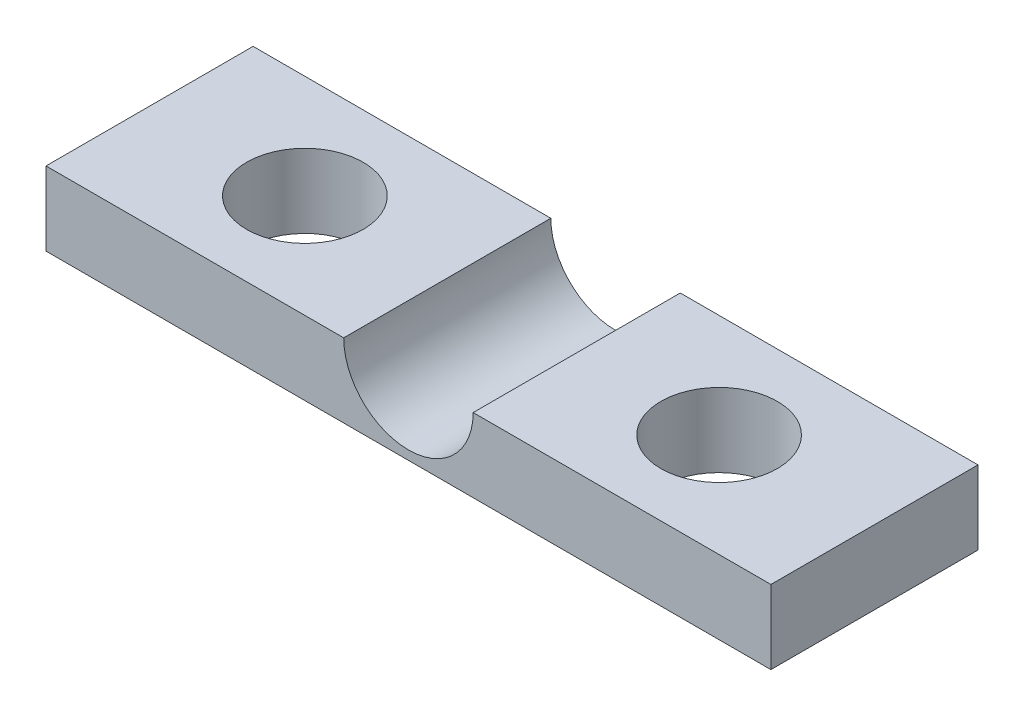
ISO-10303-21;
HEADER;
FILE_DESCRIPTION(('STEP AP214'),'2;1');
FILE_NAME('part.step','',(''),(''),'','','');
FILE_SCHEMA(('AUTOMOTIVE_DESIGN { 1 0 10303 214 1 1 1 1 }'));
ENDSEC;
DATA;
#1=APPLICATION_CONTEXT('core data for automotive mechanical design processes');
#2=APPLICATION_PROTOCOL_DEFINITION('international standard','automotive_design',2000,#1);
#3=PRODUCT_CONTEXT('',#1,'mechanical');
#4=PRODUCT('Part','Part','',(#3));
#5=PRODUCT_RELATED_PRODUCT_CATEGORY('part','',(#4));
#6=PRODUCT_DEFINITION_FORMATION('','',#4);
#7=PRODUCT_DEFINITION_CONTEXT('part definition',#1,'design');
#8=PRODUCT_DEFINITION('design','',#6,#7);
#9=PRODUCT_DEFINITION_SHAPE('','',#8);
#10=(LENGTH_UNIT() NAMED_UNIT(*) SI_UNIT(.MILLI.,.METRE.));
#11=(NAMED_UNIT(*) PLANE_ANGLE_UNIT() SI_UNIT($,.RADIAN.));
#12=(NAMED_UNIT(*) SI_UNIT($,.STERADIAN.) SOLID_ANGLE_UNIT());
#13=UNCERTAINTY_MEASURE_WITH_UNIT(LENGTH_MEASURE(1.E-05),#10,'distance_accuracy_value','');
#14=(GEOMETRIC_REPRESENTATION_CONTEXT(3) GLOBAL_UNCERTAINTY_ASSIGNED_CONTEXT((#13)) GLOBAL_UNIT_ASSIGNED_CONTEXT((#10,
#11,#12)) REPRESENTATION_CONTEXT('',''));
#15=CARTESIAN_POINT('',(0.,0.,0.));
#16=DIRECTION('',(0.,0.,1.));
#17=DIRECTION('',(1.,0.,0.));
#18=AXIS2_PLACEMENT_3D('',#15,#16,#17);
#19=CARTESIAN_POINT('',(0.,2.85,8.));
#20=DIRECTION('',(-1.,0.,0.));
#21=DIRECTION('',(0.,-1.,0.));
#22=AXIS2_PLACEMENT_3D('',#19,#20,#21);
#23=PLANE('',#22);
#24=DIRECTION('',(0.,1.,0.));
#25=VECTOR('',#24,1.);
#26=CARTESIAN_POINT('',(0.,2.85,0.));
#27=LINE('',#26,#25);
#28=CARTESIAN_POINT('',(0.,0.,0.));
#29=VERTEX_POINT('',#28);
#30=CARTESIAN_POINT('',(0.,2.85,0.));
#31=VERTEX_POINT('',#30);
#32=EDGE_CURVE('E125',#29,#31,#27,.T.);
#33=ORIENTED_EDGE('',*,*,#32,.T.);
#34=DIRECTION('',(0.,0.,-1.));
#35=VECTOR('',#34,1.);
#36=CARTESIAN_POINT('',(0.,2.85,8.));
#37=LINE('',#36,#35);
#38=CARTESIAN_POINT('',(0.,2.85,8.));
#39=VERTEX_POINT('',#38);
#40=EDGE_CURVE('E11',#39,#31,#37,.T.);
#41=ORIENTED_EDGE('',*,*,#40,.F.);
#42=DIRECTION('',(0.,1.,0.));
#43=VECTOR('',#42,1.);
#44=CARTESIAN_POINT('',(0.,2.85,8.));
#45=LINE('',#44,#43);
#46=CARTESIAN_POINT('',(0.,0.,8.));
#47=VERTEX_POINT('',#46);
#48=EDGE_CURVE('E136',#47,#39,#45,.T.);
#49=ORIENTED_EDGE('',*,*,#48,.F.);
#50=DIRECTION('',(0.,0.,-1.));
#51=VECTOR('',#50,1.);
#52=CARTESIAN_POINT('',(0.,0.,8.));
#53=LINE('',#52,#51);
#54=EDGE_CURVE('E121',#47,#29,#53,.T.);
#55=ORIENTED_EDGE('',*,*,#54,.T.);
#56=EDGE_LOOP('',(#33,#41,#49,#55));
#57=FACE_BOUND('',#56,.T.);
#58=ADVANCED_FACE('F41',(#57),#23,.F.);
#59=CARTESIAN_POINT('',(-11.5,2.85,8.));
#60=DIRECTION('',(0.,-1.,0.));
#61=DIRECTION('',(0.,0.,-1.));
#62=AXIS2_PLACEMENT_3D('',#59,#60,#61);
#63=PLANE('',#62);
#64=CARTESIAN_POINT('',(-6.,2.85,4.));
#65=DIRECTION('',(0.,1.,0.));
#66=DIRECTION('',(0.,0.,1.));
#67=AXIS2_PLACEMENT_3D('',#64,#65,#66);
#68=CIRCLE('',#67,2.25);
#69=CARTESIAN_POINT('',(-6.,2.85,6.25));
#70=VERTEX_POINT('',#69);
#71=EDGE_CURVE('E184',#70,#70,#68,.T.);
#72=ORIENTED_EDGE('',*,*,#71,.F.);
#73=EDGE_LOOP('',(#72));
#74=FACE_BOUND('',#73,.T.);
#75=DIRECTION('',(-1.,0.,0.));
#76=VECTOR('',#75,1.);
#77=CARTESIAN_POINT('',(-11.5,2.85,0.));
#78=LINE('',#77,#76);
#79=CARTESIAN_POINT('',(-11.5,2.85,0.));
#80=VERTEX_POINT('',#79);
#81=EDGE_CURVE('E128',#31,#80,#78,.T.);
#82=ORIENTED_EDGE('',*,*,#81,.T.);
#83=DIRECTION('',(0.,0.,-1.));
#84=VECTOR('',#83,1.);
#85=CARTESIAN_POINT('',(-11.5,2.85,8.));
#86=LINE('',#85,#84);
#87=CARTESIAN_POINT('',(-11.5,2.85,8.));
#88=VERTEX_POINT('',#87);
#89=EDGE_CURVE('E49',#88,#80,#86,.T.);
#90=ORIENTED_EDGE('',*,*,#89,.F.);
#91=DIRECTION('',(-1.,0.,0.));
#92=VECTOR('',#91,1.);
#93=CARTESIAN_POINT('',(-11.5,2.85,8.));
#94=LINE('',#93,#92);
#95=EDGE_CURVE('E94',#39,#88,#94,.T.);
#96=ORIENTED_EDGE('',*,*,#95,.F.);
#97=ORIENTED_EDGE('',*,*,#40,.T.);
#98=EDGE_LOOP('',(#82,#90,#96,#97));
#99=FACE_BOUND('',#98,.T.);
#100=ADVANCED_FACE('F165',(#74,#99),#63,.F.);
#101=CARTESIAN_POINT('',(-14.,2.85,8.));
#102=DIRECTION('',(0.,0.,-1.));
#103=DIRECTION('',(-1.,0.,0.));
#104=AXIS2_PLACEMENT_3D('',#101,#102,#103);
#105=CYLINDRICAL_SURFACE('',#104,2.5);
#106=CARTESIAN_POINT('',(-14.,2.85,0.));
#107=DIRECTION('',(0.,0.,-1.));
#108=DIRECTION('',(1.,0.,0.));
#109=AXIS2_PLACEMENT_3D('',#106,#107,#108);
#110=CIRCLE('',#109,2.5);
#111=CARTESIAN_POINT('',(-16.5,2.85,0.));
#112=VERTEX_POINT('',#111);
#113=EDGE_CURVE('E131',#80,#112,#110,.T.);
#114=ORIENTED_EDGE('',*,*,#113,.T.);
#115=DIRECTION('',(0.,0.,-1.));
#116=VECTOR('',#115,1.);
#117=CARTESIAN_POINT('',(-16.5,2.85,8.));
#118=LINE('',#117,#116);
#119=CARTESIAN_POINT('',(-16.5,2.85,8.));
#120=VERTEX_POINT('',#119);
#121=EDGE_CURVE('E116',#120,#112,#118,.T.);
#122=ORIENTED_EDGE('',*,*,#121,.F.);
#123=CARTESIAN_POINT('',(-14.,2.85,8.));
#124=DIRECTION('',(0.,0.,-1.));
#125=DIRECTION('',(1.,0.,0.));
#126=AXIS2_PLACEMENT_3D('',#123,#124,#125);
#127=CIRCLE('',#126,2.5);
#128=EDGE_CURVE('E107',#88,#120,#127,.T.);
#129=ORIENTED_EDGE('',*,*,#128,.F.);
#130=ORIENTED_EDGE('',*,*,#89,.T.);
#131=EDGE_LOOP('',(#114,#122,#129,#130));
#132=FACE_BOUND('',#131,.T.);
#133=ADVANCED_FACE('F142',(#132),#105,.F.);
#134=CARTESIAN_POINT('',(-28.,2.85,8.));
#135=DIRECTION('',(0.,-1.,0.));
#136=DIRECTION('',(0.,0.,-1.));
#137=AXIS2_PLACEMENT_3D('',#134,#135,#136);
#138=PLANE('',#137);
#139=CARTESIAN_POINT('',(-22.,2.85,4.));
#140=DIRECTION('',(0.,1.,0.));
#141=DIRECTION('',(0.,0.,1.));
#142=AXIS2_PLACEMENT_3D('',#139,#140,#141);
#143=CIRCLE('',#142,2.25);
#144=CARTESIAN_POINT('',(-22.,2.85,6.25));
#145=VERTEX_POINT('',#144);
#146=EDGE_CURVE('E182',#145,#145,#143,.T.);
#147=ORIENTED_EDGE('',*,*,#146,.F.);
#148=EDGE_LOOP('',(#147));
#149=FACE_BOUND('',#148,.T.);
#150=DIRECTION('',(-1.,0.,0.));
#151=VECTOR('',#150,1.);
#152=CARTESIAN_POINT('',(-28.,2.85,0.));
#153=LINE('',#152,#151);
#154=CARTESIAN_POINT('',(-28.,2.85,0.));
#155=VERTEX_POINT('',#154);
#156=EDGE_CURVE('E115',#112,#155,#153,.T.);
#157=ORIENTED_EDGE('',*,*,#156,.T.);
#158=DIRECTION('',(0.,0.,-1.));
#159=VECTOR('',#158,1.);
#160=CARTESIAN_POINT('',(-28.,2.85,8.));
#161=LINE('',#160,#159);
#162=CARTESIAN_POINT('',(-28.,2.85,8.));
#163=VERTEX_POINT('',#162);
#164=EDGE_CURVE('E112',#163,#155,#161,.T.);
#165=ORIENTED_EDGE('',*,*,#164,.F.);
#166=DIRECTION('',(-1.,0.,0.));
#167=VECTOR('',#166,1.);
#168=CARTESIAN_POINT('',(-28.,2.85,8.));
#169=LINE('',#168,#167);
#170=EDGE_CURVE('E101',#120,#163,#169,.T.);
#171=ORIENTED_EDGE('',*,*,#170,.F.);
#172=ORIENTED_EDGE('',*,*,#121,.T.);
#173=EDGE_LOOP('',(#157,#165,#171,#172));
#174=FACE_BOUND('',#173,.T.);
#175=ADVANCED_FACE('F113',(#149,#174),#138,.F.);
#176=CARTESIAN_POINT('',(-28.,0.,8.));
#177=DIRECTION('',(1.,0.,0.));
#178=DIRECTION('',(0.,0.,-1.));
#179=AXIS2_PLACEMENT_3D('',#176,#177,#178);
#180=PLANE('',#179);
#181=DIRECTION('',(0.,-1.,0.));
#182=VECTOR('',#181,1.);
#183=CARTESIAN_POINT('',(-28.,0.,0.));
#184=LINE('',#183,#182);
#185=CARTESIAN_POINT('',(-28.,0.,0.));
#186=VERTEX_POINT('',#185);
#187=EDGE_CURVE('E80',#155,#186,#184,.T.);
#188=ORIENTED_EDGE('',*,*,#187,.T.);
#189=DIRECTION('',(0.,0.,-1.));
#190=VECTOR('',#189,1.);
#191=CARTESIAN_POINT('',(-28.,0.,8.));
#192=LINE('',#191,#190);
#193=CARTESIAN_POINT('',(-28.,0.,8.));
#194=VERTEX_POINT('',#193);
#195=EDGE_CURVE('E117',#194,#186,#192,.T.);
#196=ORIENTED_EDGE('',*,*,#195,.F.);
#197=DIRECTION('',(0.,-1.,0.));
#198=VECTOR('',#197,1.);
#199=CARTESIAN_POINT('',(-28.,0.,8.));
#200=LINE('',#199,#198);
#201=EDGE_CURVE('E105',#163,#194,#200,.T.);
#202=ORIENTED_EDGE('',*,*,#201,.F.);
#203=ORIENTED_EDGE('',*,*,#164,.T.);
#204=EDGE_LOOP('',(#188,#196,#202,#203));
#205=FACE_BOUND('',#204,.T.);
#206=ADVANCED_FACE('F119',(#205),#180,.F.);
#207=CARTESIAN_POINT('',(0.,0.,8.));
#208=DIRECTION('',(0.,1.,0.));
#209=DIRECTION('',(0.,0.,1.));
#210=AXIS2_PLACEMENT_3D('',#207,#208,#209);
#211=PLANE('',#210);
#212=CARTESIAN_POINT('',(-22.,0.,4.));
#213=DIRECTION('',(0.,1.,0.));
#214=DIRECTION('',(0.,0.,1.));
#215=AXIS2_PLACEMENT_3D('',#212,#213,#214);
#216=CIRCLE('',#215,2.25);
#217=CARTESIAN_POINT('',(-22.,0.,6.25));
#218=VERTEX_POINT('',#217);
#219=EDGE_CURVE('E129',#218,#218,#216,.F.);
#220=ORIENTED_EDGE('',*,*,#219,.F.);
#221=EDGE_LOOP('',(#220));
#222=FACE_BOUND('',#221,.T.);
#223=CARTESIAN_POINT('',(-6.,0.,4.));
#224=DIRECTION('',(0.,1.,0.));
#225=DIRECTION('',(0.,0.,1.));
#226=AXIS2_PLACEMENT_3D('',#223,#224,#225);
#227=CIRCLE('',#226,2.25);
#228=CARTESIAN_POINT('',(-6.,0.,6.25));
#229=VERTEX_POINT('',#228);
#230=EDGE_CURVE('E189',#229,#229,#227,.F.);
#231=ORIENTED_EDGE('',*,*,#230,.F.);
#232=EDGE_LOOP('',(#231));
#233=FACE_BOUND('',#232,.T.);
#234=DIRECTION('',(1.,0.,0.));
#235=VECTOR('',#234,1.);
#236=CARTESIAN_POINT('',(0.,0.,0.));
#237=LINE('',#236,#235);
#238=EDGE_CURVE('E86',#186,#29,#237,.T.);
#239=ORIENTED_EDGE('',*,*,#238,.T.);
#240=ORIENTED_EDGE('',*,*,#54,.F.);
#241=DIRECTION('',(1.,0.,0.));
#242=VECTOR('',#241,1.);
#243=CARTESIAN_POINT('',(0.,0.,8.));
#244=LINE('',#243,#242);
#245=EDGE_CURVE('E57',#194,#47,#244,.T.);
#246=ORIENTED_EDGE('',*,*,#245,.F.);
#247=ORIENTED_EDGE('',*,*,#195,.T.);
#248=EDGE_LOOP('',(#239,#240,#246,#247));
#249=FACE_BOUND('',#248,.T.);
#250=ADVANCED_FACE('F149',(#222,#233,#249),#211,.F.);
#251=CARTESIAN_POINT('',(-14.,2.85,8.));
#252=DIRECTION('',(0.,0.,1.));
#253=DIRECTION('',(1.,0.,0.));
#254=AXIS2_PLACEMENT_3D('',#251,#252,#253);
#255=PLANE('',#254);
#256=ORIENTED_EDGE('',*,*,#48,.T.);
#257=ORIENTED_EDGE('',*,*,#95,.T.);
#258=ORIENTED_EDGE('',*,*,#128,.T.);
#259=ORIENTED_EDGE('',*,*,#170,.T.);
#260=ORIENTED_EDGE('',*,*,#201,.T.);
#261=ORIENTED_EDGE('',*,*,#245,.T.);
#262=EDGE_LOOP('',(#256,#257,#258,#259,#260,#261));
#263=FACE_BOUND('',#262,.T.);
#264=ADVANCED_FACE('F103',(#263),#255,.T.);
#265=CARTESIAN_POINT('',(-14.,2.85,0.));
#266=DIRECTION('',(0.,0.,1.));
#267=DIRECTION('',(1.,0.,0.));
#268=AXIS2_PLACEMENT_3D('',#265,#266,#267);
#269=PLANE('',#268);
#270=ORIENTED_EDGE('',*,*,#32,.F.);
#271=ORIENTED_EDGE('',*,*,#238,.F.);
#272=ORIENTED_EDGE('',*,*,#187,.F.);
#273=ORIENTED_EDGE('',*,*,#156,.F.);
#274=ORIENTED_EDGE('',*,*,#113,.F.);
#275=ORIENTED_EDGE('',*,*,#81,.F.);
#276=EDGE_LOOP('',(#270,#271,#272,#273,#274,#275));
#277=FACE_BOUND('',#276,.T.);
#278=ADVANCED_FACE('F145',(#277),#269,.F.);
#279=CARTESIAN_POINT('',(-6.,-0.00100000000000013,4.));
#280=DIRECTION('',(0.,1.,0.));
#281=DIRECTION('',(0.,0.,1.));
#282=AXIS2_PLACEMENT_3D('',#279,#280,#281);
#283=CYLINDRICAL_SURFACE('',#282,2.25);
#284=ORIENTED_EDGE('',*,*,#71,.T.);
#285=EDGE_LOOP('',(#284));
#286=FACE_BOUND('',#285,.T.);
#287=ORIENTED_EDGE('',*,*,#230,.T.);
#288=EDGE_LOOP('',(#287));
#289=FACE_BOUND('',#288,.T.);
#290=ADVANCED_FACE('F197',(#286,#289),#283,.F.);
#291=CARTESIAN_POINT('',(-22.,-0.00100000000000013,4.));
#292=DIRECTION('',(0.,1.,0.));
#293=DIRECTION('',(0.,0.,1.));
#294=AXIS2_PLACEMENT_3D('',#291,#292,#293);
#295=CYLINDRICAL_SURFACE('',#294,2.25);
#296=ORIENTED_EDGE('',*,*,#146,.T.);
#297=EDGE_LOOP('',(#296));
#298=FACE_BOUND('',#297,.T.);
#299=ORIENTED_EDGE('',*,*,#219,.T.);
#300=EDGE_LOOP('',(#299));
#301=FACE_BOUND('',#300,.T.);
#302=ADVANCED_FACE('F198',(#298,#301),#295,.F.);
#303=CLOSED_SHELL('',(#58,#100,#133,#175,#206,#250,#264,#278,#290,#302));
#304=MANIFOLD_SOLID_BREP('B2',#303);
#305=ADVANCED_BREP_SHAPE_REPRESENTATION('',(#18,#304),#14);
#306=SHAPE_DEFINITION_REPRESENTATION(#9,#305);
ENDSEC;
END-ISO-10303-21;
